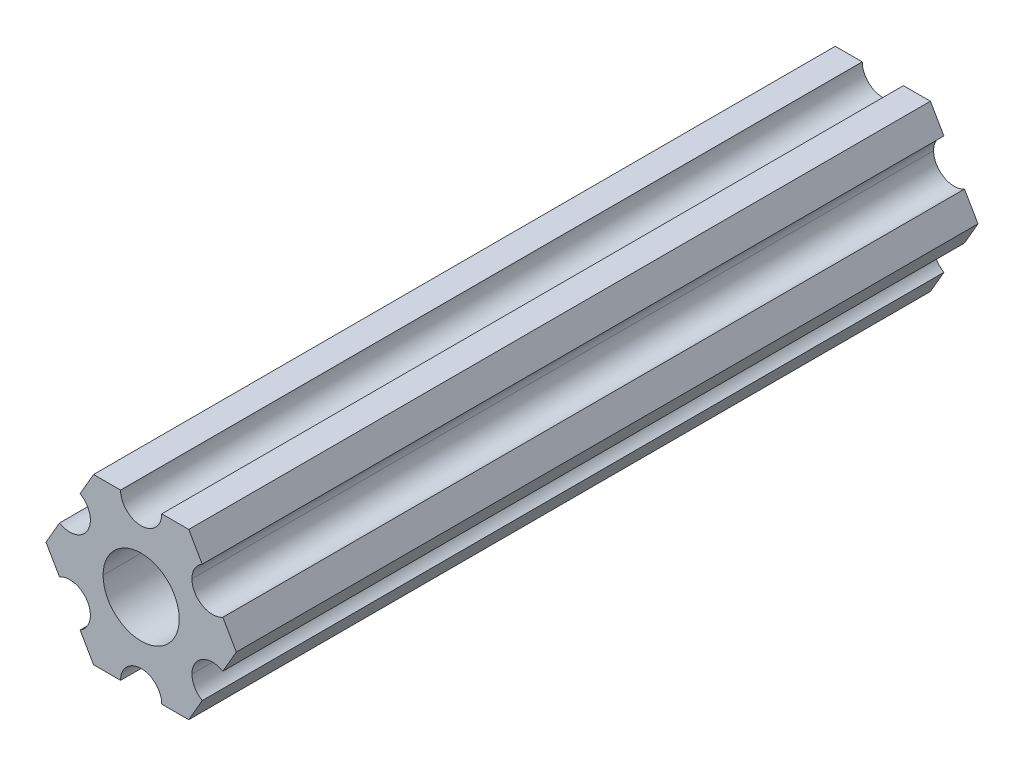
ISO-10303-21;
HEADER;
FILE_DESCRIPTION(('STEP AP214'),'2;1');
FILE_NAME('part.step','',(''),(''),'','','');
FILE_SCHEMA(('AUTOMOTIVE_DESIGN { 1 0 10303 214 1 1 1 1 }'));
ENDSEC;
DATA;
#1=APPLICATION_CONTEXT('core data for automotive mechanical design processes');
#2=APPLICATION_PROTOCOL_DEFINITION('international standard','automotive_design',2000,#1);
#3=PRODUCT_CONTEXT('',#1,'mechanical');
#4=PRODUCT('Part','Part','',(#3));
#5=PRODUCT_RELATED_PRODUCT_CATEGORY('part','',(#4));
#6=PRODUCT_DEFINITION_FORMATION('','',#4);
#7=PRODUCT_DEFINITION_CONTEXT('part definition',#1,'design');
#8=PRODUCT_DEFINITION('design','',#6,#7);
#9=PRODUCT_DEFINITION_SHAPE('','',#8);
#10=(LENGTH_UNIT() NAMED_UNIT(*) SI_UNIT(.MILLI.,.METRE.));
#11=(NAMED_UNIT(*) PLANE_ANGLE_UNIT() SI_UNIT($,.RADIAN.));
#12=(NAMED_UNIT(*) SI_UNIT($,.STERADIAN.) SOLID_ANGLE_UNIT());
#13=UNCERTAINTY_MEASURE_WITH_UNIT(LENGTH_MEASURE(1.E-05),#10,'distance_accuracy_value','');
#14=(GEOMETRIC_REPRESENTATION_CONTEXT(3) GLOBAL_UNCERTAINTY_ASSIGNED_CONTEXT((#13)) GLOBAL_UNIT_ASSIGNED_CONTEXT((#10,
#11,#12)) REPRESENTATION_CONTEXT('',''));
#15=CARTESIAN_POINT('',(0.,0.,0.));
#16=DIRECTION('',(0.,0.,1.));
#17=DIRECTION('',(1.,0.,0.));
#18=AXIS2_PLACEMENT_3D('',#15,#16,#17);
#19=CARTESIAN_POINT('',(0.,0.,304.8));
#20=DIRECTION('',(0.,0.,-1.));
#21=DIRECTION('',(-1.,0.,0.));
#22=AXIS2_PLACEMENT_3D('',#19,#20,#21);
#23=CYLINDRICAL_SURFACE('',#22,2.9337);
#24=CARTESIAN_POINT('',(0.,0.,57.15));
#25=DIRECTION('',(0.,0.,1.));
#26=DIRECTION('',(1.,0.,0.));
#27=AXIS2_PLACEMENT_3D('',#24,#25,#26);
#28=CIRCLE('',#27,2.9337);
#29=CARTESIAN_POINT('',(2.9337,0.,57.15));
#30=VERTEX_POINT('',#29);
#31=CARTESIAN_POINT('',(-2.9337,0.,57.15));
#32=VERTEX_POINT('',#31);
#33=EDGE_CURVE('E66',#30,#32,#28,.F.);
#34=ORIENTED_EDGE('',*,*,#33,.F.);
#35=DIRECTION('',(0.,0.,-1.));
#36=VECTOR('',#35,1.);
#37=CARTESIAN_POINT('',(2.9337,0.,304.8));
#38=LINE('',#37,#36);
#39=CARTESIAN_POINT('',(2.9337,0.,0.));
#40=VERTEX_POINT('',#39);
#41=EDGE_CURVE('E53',#30,#40,#38,.T.);
#42=ORIENTED_EDGE('',*,*,#41,.T.);
#43=CARTESIAN_POINT('',(0.,0.,0.));
#44=DIRECTION('',(0.,0.,1.));
#45=DIRECTION('',(1.,0.,0.));
#46=AXIS2_PLACEMENT_3D('',#43,#44,#45);
#47=CIRCLE('',#46,2.9337);
#48=CARTESIAN_POINT('',(-2.9337,0.,0.));
#49=VERTEX_POINT('',#48);
#50=EDGE_CURVE('E249',#49,#40,#47,.T.);
#51=ORIENTED_EDGE('',*,*,#50,.F.);
#52=DIRECTION('',(0.,0.,-1.));
#53=VECTOR('',#52,1.);
#54=CARTESIAN_POINT('',(-2.9337,0.,304.8));
#55=LINE('',#54,#53);
#56=EDGE_CURVE('E219',#32,#49,#55,.T.);
#57=ORIENTED_EDGE('',*,*,#56,.F.);
#58=EDGE_LOOP('',(#34,#42,#51,#57));
#59=FACE_BOUND('',#58,.T.);
#60=ADVANCED_FACE('F46',(#59),#23,.F.);
#61=CARTESIAN_POINT('',(5.49926150638082,-3.17499966684067,304.8));
#62=DIRECTION('',(0.,0.,-1.));
#63=DIRECTION('',(-1.,0.,0.));
#64=AXIS2_PLACEMENT_3D('',#61,#62,#63);
#65=CYLINDRICAL_SURFACE('',#64,1.5875);
#66=CARTESIAN_POINT('',(5.49926150638082,-3.17499966684067,57.15));
#67=DIRECTION('',(0.,0.,1.));
#68=DIRECTION('',(1.,0.,0.));
#69=AXIS2_PLACEMENT_3D('',#66,#67,#68);
#70=CIRCLE('',#69,1.5875);
#71=CARTESIAN_POINT('',(3.91176150638082,-3.17499966684067,57.15));
#72=VERTEX_POINT('',#71);
#73=CARTESIAN_POINT('',(6.29301142309098,-1.80018429024546,57.15));
#74=VERTEX_POINT('',#73);
#75=EDGE_CURVE('E373',#72,#74,#70,.F.);
#76=ORIENTED_EDGE('',*,*,#75,.F.);
#77=DIRECTION('',(0.,0.,-1.));
#78=VECTOR('',#77,1.);
#79=CARTESIAN_POINT('',(3.91176150638082,-3.17499966684067,304.8));
#80=LINE('',#79,#78);
#81=CARTESIAN_POINT('',(3.91176150638082,-3.17499966684067,0.));
#82=VERTEX_POINT('',#81);
#83=EDGE_CURVE('E226',#72,#82,#80,.T.);
#84=ORIENTED_EDGE('',*,*,#83,.T.);
#85=CARTESIAN_POINT('',(5.49926150638082,-3.17499966684067,0.));
#86=DIRECTION('',(0.,0.,-1.));
#87=DIRECTION('',(1.,0.,0.));
#88=AXIS2_PLACEMENT_3D('',#85,#86,#87);
#89=CIRCLE('',#88,1.5875);
#90=CARTESIAN_POINT('',(6.29301142309098,-1.80018429024546,0.));
#91=VERTEX_POINT('',#90);
#92=EDGE_CURVE('E228',#82,#91,#89,.T.);
#93=ORIENTED_EDGE('',*,*,#92,.T.);
#94=DIRECTION('',(0.,0.,-1.));
#95=VECTOR('',#94,1.);
#96=CARTESIAN_POINT('',(6.29301142309098,-1.80018429024546,304.8));
#97=LINE('',#96,#95);
#98=EDGE_CURVE('E354',#74,#91,#97,.T.);
#99=ORIENTED_EDGE('',*,*,#98,.F.);
#100=EDGE_LOOP('',(#76,#84,#93,#99));
#101=FACE_BOUND('',#100,.T.);
#102=ADVANCED_FACE('F409',(#101),#65,.F.);
#103=CARTESIAN_POINT('',(5.49926112168156,3.17500033315934,304.8));
#104=DIRECTION('',(0.,0.,-1.));
#105=DIRECTION('',(-1.,0.,0.));
#106=AXIS2_PLACEMENT_3D('',#103,#104,#105);
#107=CYLINDRICAL_SURFACE('',#106,1.5875);
#108=CARTESIAN_POINT('',(5.49926112168156,3.17500033315934,57.15));
#109=DIRECTION('',(0.,0.,1.));
#110=DIRECTION('',(1.,0.,0.));
#111=AXIS2_PLACEMENT_3D('',#108,#109,#110);
#112=CIRCLE('',#111,1.5875);
#113=CARTESIAN_POINT('',(3.91176112168156,3.17500033315934,57.15));
#114=VERTEX_POINT('',#113);
#115=CARTESIAN_POINT('',(4.70551103839172,4.54981561357972,57.15));
#116=VERTEX_POINT('',#115);
#117=EDGE_CURVE('E375',#114,#116,#112,.F.);
#118=ORIENTED_EDGE('',*,*,#117,.F.);
#119=DIRECTION('',(0.,0.,-1.));
#120=VECTOR('',#119,1.);
#121=CARTESIAN_POINT('',(3.91176112168156,3.17500033315934,304.8));
#122=LINE('',#121,#120);
#123=CARTESIAN_POINT('',(3.91176112168156,3.17500033315934,0.));
#124=VERTEX_POINT('',#123);
#125=EDGE_CURVE('E248',#114,#124,#122,.T.);
#126=ORIENTED_EDGE('',*,*,#125,.T.);
#127=CARTESIAN_POINT('',(5.49926112168156,3.17500033315934,0.));
#128=DIRECTION('',(0.,0.,-1.));
#129=DIRECTION('',(1.,0.,0.));
#130=AXIS2_PLACEMENT_3D('',#127,#128,#129);
#131=CIRCLE('',#130,1.5875);
#132=CARTESIAN_POINT('',(4.70551103839172,4.54981561357972,0.));
#133=VERTEX_POINT('',#132);
#134=EDGE_CURVE('E244',#124,#133,#131,.T.);
#135=ORIENTED_EDGE('',*,*,#134,.T.);
#136=DIRECTION('',(0.,0.,-1.));
#137=VECTOR('',#136,1.);
#138=CARTESIAN_POINT('',(4.70551103839172,4.54981561357972,304.8));
#139=LINE('',#138,#137);
#140=EDGE_CURVE('E287',#116,#133,#139,.T.);
#141=ORIENTED_EDGE('',*,*,#140,.F.);
#142=EDGE_LOOP('',(#118,#126,#135,#141));
#143=FACE_BOUND('',#142,.T.);
#144=ADVANCED_FACE('F483',(#143),#107,.F.);
#145=CARTESIAN_POINT('',(6.29301142309098,-1.80018429024546,304.8));
#146=DIRECTION('',(-0.866025434075723,0.499999947533953,0.));
#147=DIRECTION('',(0.,0.,1.));
#148=AXIS2_PLACEMENT_3D('',#145,#146,#147);
#149=PLANE('',#148);
#150=DIRECTION('',(0.499999947533953,0.866025434075723,0.));
#151=VECTOR('',#150,1.);
#152=CARTESIAN_POINT('',(6.29301142309098,-1.80018429024546,57.15));
#153=LINE('',#152,#151);
#154=CARTESIAN_POINT('',(7.33234841870827,4.44212519169686E-07,57.15));
#155=VERTEX_POINT('',#154);
#156=EDGE_CURVE('E293',#74,#155,#153,.T.);
#157=ORIENTED_EDGE('',*,*,#156,.F.);
#158=ORIENTED_EDGE('',*,*,#98,.T.);
#159=DIRECTION('',(0.499999947533953,0.866025434075723,0.));
#160=VECTOR('',#159,1.);
#161=CARTESIAN_POINT('',(6.29301142309098,-1.80018429024546,0.));
#162=LINE('',#161,#160);
#163=CARTESIAN_POINT('',(7.33234841870827,4.44212519169686E-07,0.));
#164=VERTEX_POINT('',#163);
#165=EDGE_CURVE('E252',#91,#164,#162,.T.);
#166=ORIENTED_EDGE('',*,*,#165,.T.);
#167=DIRECTION('',(0.,0.,-1.));
#168=VECTOR('',#167,1.);
#169=CARTESIAN_POINT('',(7.33234841870827,4.44212519169686E-07,304.8));
#170=LINE('',#169,#168);
#171=EDGE_CURVE('E259',#155,#164,#170,.T.);
#172=ORIENTED_EDGE('',*,*,#171,.F.);
#173=EDGE_LOOP('',(#157,#158,#166,#172));
#174=FACE_BOUND('',#173,.T.);
#175=ADVANCED_FACE('F492',(#174),#149,.F.);
#176=CARTESIAN_POINT('',(7.33234841870827,4.44212519169686E-07,304.8));
#177=DIRECTION('',(-0.866025373493145,-0.500000052466057,0.));
#178=DIRECTION('',(-0.500000052466057,0.866025373493145,0.));
#179=AXIS2_PLACEMENT_3D('',#176,#177,#178);
#180=PLANE('',#179);
#181=DIRECTION('',(-0.500000052466057,0.866025373493145,0.));
#182=VECTOR('',#181,1.);
#183=CARTESIAN_POINT('',(7.33234841870827,4.44212519169686E-07,57.15));
#184=LINE('',#183,#182);
#185=CARTESIAN_POINT('',(6.29301120497139,1.80018505273895,57.15));
#186=VERTEX_POINT('',#185);
#187=EDGE_CURVE('E369',#155,#186,#184,.T.);
#188=ORIENTED_EDGE('',*,*,#187,.F.);
#189=ORIENTED_EDGE('',*,*,#171,.T.);
#190=DIRECTION('',(-0.500000052466056,0.866025373493145,0.));
#191=VECTOR('',#190,1.);
#192=CARTESIAN_POINT('',(7.33234841870827,4.44212519169686E-07,0.));
#193=LINE('',#192,#191);
#194=CARTESIAN_POINT('',(6.29301120497139,1.80018505273894,0.));
#195=VERTEX_POINT('',#194);
#196=EDGE_CURVE('E342',#164,#195,#193,.T.);
#197=ORIENTED_EDGE('',*,*,#196,.T.);
#198=DIRECTION('',(0.,0.,-1.));
#199=VECTOR('',#198,1.);
#200=CARTESIAN_POINT('',(6.29301120497139,1.80018505273894,304.8));
#201=LINE('',#200,#199);
#202=EDGE_CURVE('E257',#186,#195,#201,.T.);
#203=ORIENTED_EDGE('',*,*,#202,.F.);
#204=EDGE_LOOP('',(#188,#189,#197,#203));
#205=FACE_BOUND('',#204,.T.);
#206=ADVANCED_FACE('F490',(#205),#180,.F.);
#207=CARTESIAN_POINT('',(5.49926112168156,3.17500033315934,304.8));
#208=DIRECTION('',(0.,0.,-1.));
#209=DIRECTION('',(-1.,0.,0.));
#210=AXIS2_PLACEMENT_3D('',#207,#208,#209);
#211=CYLINDRICAL_SURFACE('',#210,1.5875);
#212=CARTESIAN_POINT('',(5.49926112168156,3.17500033315934,57.15));
#213=DIRECTION('',(0.,0.,1.));
#214=DIRECTION('',(1.,0.,0.));
#215=AXIS2_PLACEMENT_3D('',#212,#213,#214);
#216=CIRCLE('',#215,1.5875);
#217=EDGE_CURVE('E371',#186,#114,#216,.F.);
#218=ORIENTED_EDGE('',*,*,#217,.F.);
#219=ORIENTED_EDGE('',*,*,#202,.T.);
#220=CARTESIAN_POINT('',(5.49926112168156,3.17500033315934,0.));
#221=DIRECTION('',(0.,0.,-1.));
#222=DIRECTION('',(1.,0.,0.));
#223=AXIS2_PLACEMENT_3D('',#220,#221,#222);
#224=CIRCLE('',#223,1.5875);
#225=EDGE_CURVE('E260',#195,#124,#224,.T.);
#226=ORIENTED_EDGE('',*,*,#225,.T.);
#227=ORIENTED_EDGE('',*,*,#125,.F.);
#228=EDGE_LOOP('',(#218,#219,#226,#227));
#229=FACE_BOUND('',#228,.T.);
#230=ADVANCED_FACE('F488',(#229),#211,.F.);
#231=CARTESIAN_POINT('',(4.70551103839172,4.54981561357972,304.8));
#232=DIRECTION('',(-0.866025373493151,-0.500000052466046,0.));
#233=DIRECTION('',(-0.500000052466046,0.866025373493151,0.));
#234=AXIS2_PLACEMENT_3D('',#231,#232,#233);
#235=PLANE('',#234);
#236=DIRECTION('',(-0.500000052466046,0.866025373493151,0.));
#237=VECTOR('',#236,1.);
#238=CARTESIAN_POINT('',(4.70551103839172,4.54981561357972,57.15));
#239=LINE('',#238,#237);
#240=CARTESIAN_POINT('',(3.66617382465481,6.35000022210627,57.15));
#241=VERTEX_POINT('',#240);
#242=EDGE_CURVE('E377',#116,#241,#239,.T.);
#243=ORIENTED_EDGE('',*,*,#242,.F.);
#244=ORIENTED_EDGE('',*,*,#140,.T.);
#245=DIRECTION('',(-0.500000052466046,0.866025373493151,0.));
#246=VECTOR('',#245,1.);
#247=CARTESIAN_POINT('',(4.70551103839172,4.54981561357972,0.));
#248=LINE('',#247,#246);
#249=CARTESIAN_POINT('',(3.66617382465481,6.35000022210627,0.));
#250=VERTEX_POINT('',#249);
#251=EDGE_CURVE('E306',#133,#250,#248,.T.);
#252=ORIENTED_EDGE('',*,*,#251,.T.);
#253=DIRECTION('',(0.,0.,-1.));
#254=VECTOR('',#253,1.);
#255=CARTESIAN_POINT('',(3.66617382465481,6.35000022210627,304.8));
#256=LINE('',#255,#254);
#257=EDGE_CURVE('E288',#241,#250,#256,.T.);
#258=ORIENTED_EDGE('',*,*,#257,.F.);
#259=EDGE_LOOP('',(#243,#244,#252,#258));
#260=FACE_BOUND('',#259,.T.);
#261=ADVANCED_FACE('F479',(#260),#235,.F.);
#262=CARTESIAN_POINT('',(3.66617382465481,6.35000022210627,304.8));
#263=DIRECTION('',(6.05825850611185E-08,-1.,0.));
#264=DIRECTION('',(0.,0.,-1.));
#265=AXIS2_PLACEMENT_3D('',#262,#263,#264);
#266=PLANE('',#265);
#267=DIRECTION('',(-0.999999999999998,-6.05825850611184E-08,0.));
#268=VECTOR('',#267,1.);
#269=CARTESIAN_POINT('',(3.66617382465481,6.35000022210627,57.15));
#270=LINE('',#269,#268);
#271=CARTESIAN_POINT('',(1.58749961530074,6.35,57.15));
#272=VERTEX_POINT('',#271);
#273=EDGE_CURVE('E379',#241,#272,#270,.T.);
#274=ORIENTED_EDGE('',*,*,#273,.F.);
#275=ORIENTED_EDGE('',*,*,#257,.T.);
#276=DIRECTION('',(-1.,-6.05825850611185E-08,0.));
#277=VECTOR('',#276,1.);
#278=CARTESIAN_POINT('',(3.66617382465481,6.35000022210627,0.));
#279=LINE('',#278,#277);
#280=CARTESIAN_POINT('',(1.58749961530074,6.35000009617482,0.));
#281=VERTEX_POINT('',#280);
#282=EDGE_CURVE('E283',#250,#281,#279,.T.);
#283=ORIENTED_EDGE('',*,*,#282,.T.);
#284=DIRECTION('',(0.,0.,-1.));
#285=VECTOR('',#284,1.);
#286=CARTESIAN_POINT('',(1.58749961530074,6.35000009617482,304.8));
#287=LINE('',#286,#285);
#288=EDGE_CURVE('E261',#272,#281,#287,.T.);
#289=ORIENTED_EDGE('',*,*,#288,.F.);
#290=EDGE_LOOP('',(#274,#275,#283,#289));
#291=FACE_BOUND('',#290,.T.);
#292=ADVANCED_FACE('F473',(#291),#266,.F.);
#293=CARTESIAN_POINT('',(-3.84699260060323E-07,6.35,304.8));
#294=DIRECTION('',(0.,0.,-1.));
#295=DIRECTION('',(-1.,0.,0.));
#296=AXIS2_PLACEMENT_3D('',#293,#294,#295);
#297=CYLINDRICAL_SURFACE('',#296,1.5875);
#298=CARTESIAN_POINT('',(-3.84699260060323E-07,6.35,57.15));
#299=DIRECTION('',(0.,0.,1.));
#300=DIRECTION('',(1.,0.,0.));
#301=AXIS2_PLACEMENT_3D('',#298,#299,#300);
#302=CIRCLE('',#301,1.5875);
#303=CARTESIAN_POINT('',(-1.58750038469926,6.34999990382518,57.15));
#304=VERTEX_POINT('',#303);
#305=EDGE_CURVE('E381',#272,#304,#302,.F.);
#306=ORIENTED_EDGE('',*,*,#305,.F.);
#307=ORIENTED_EDGE('',*,*,#288,.T.);
#308=CARTESIAN_POINT('',(-3.84699260060323E-07,6.35,0.));
#309=DIRECTION('',(0.,0.,-1.));
#310=DIRECTION('',(1.,0.,0.));
#311=AXIS2_PLACEMENT_3D('',#308,#309,#310);
#312=CIRCLE('',#311,1.5875);
#313=CARTESIAN_POINT('',(-1.58750038469926,6.34999990382519,0.));
#314=VERTEX_POINT('',#313);
#315=EDGE_CURVE('E263',#281,#314,#312,.T.);
#316=ORIENTED_EDGE('',*,*,#315,.T.);
#317=DIRECTION('',(0.,0.,-1.));
#318=VECTOR('',#317,1.);
#319=CARTESIAN_POINT('',(-1.58750038469926,6.34999990382519,304.8));
#320=LINE('',#319,#318);
#321=EDGE_CURVE('E300',#304,#314,#320,.T.);
#322=ORIENTED_EDGE('',*,*,#321,.F.);
#323=EDGE_LOOP('',(#306,#307,#316,#322));
#324=FACE_BOUND('',#323,.T.);
#325=ADVANCED_FACE('F469',(#324),#297,.F.);
#326=CARTESIAN_POINT('',(-1.58750038469926,6.34999990382518,304.8));
#327=DIRECTION('',(6.05825963273174E-08,-1.,0.));
#328=DIRECTION('',(0.,0.,-1.));
#329=AXIS2_PLACEMENT_3D('',#326,#327,#328);
#330=PLANE('',#329);
#331=DIRECTION('',(-0.999999999999998,-6.05825963273173E-08,0.));
#332=VECTOR('',#331,1.);
#333=CARTESIAN_POINT('',(-1.58750038469926,6.34999990382518,57.15));
#334=LINE('',#333,#332);
#335=CARTESIAN_POINT('',(-3.66617459405349,6.3499997778937,57.15));
#336=VERTEX_POINT('',#335);
#337=EDGE_CURVE('E383',#304,#336,#334,.T.);
#338=ORIENTED_EDGE('',*,*,#337,.F.);
#339=ORIENTED_EDGE('',*,*,#321,.T.);
#340=DIRECTION('',(-1.,-6.05825963273174E-08,0.));
#341=VECTOR('',#340,1.);
#342=CARTESIAN_POINT('',(-1.58750038469926,6.34999990382518,0.));
#343=LINE('',#342,#341);
#344=CARTESIAN_POINT('',(-3.66617459405349,6.3499997778937,0.));
#345=VERTEX_POINT('',#344);
#346=EDGE_CURVE('E264',#314,#345,#343,.T.);
#347=ORIENTED_EDGE('',*,*,#346,.T.);
#348=DIRECTION('',(0.,0.,-1.));
#349=VECTOR('',#348,1.);
#350=CARTESIAN_POINT('',(-3.66617459405349,6.3499997778937,304.8));
#351=LINE('',#350,#349);
#352=EDGE_CURVE('E279',#336,#345,#351,.T.);
#353=ORIENTED_EDGE('',*,*,#352,.F.);
#354=EDGE_LOOP('',(#338,#339,#347,#353));
#355=FACE_BOUND('',#354,.T.);
#356=ADVANCED_FACE('F511',(#355),#330,.F.);
#357=CARTESIAN_POINT('',(-3.66617459405349,6.3499997778937,304.8));
#358=DIRECTION('',(0.866025434075729,-0.499999947533942,0.));
#359=DIRECTION('',(0.,0.,-1.));
#360=AXIS2_PLACEMENT_3D('',#357,#358,#359);
#361=PLANE('',#360);
#362=DIRECTION('',(-0.499999947533942,-0.866025434075729,0.));
#363=VECTOR('',#362,1.);
#364=CARTESIAN_POINT('',(-3.66617459405349,6.3499997778937,57.15));
#365=LINE('',#364,#363);
#366=CARTESIAN_POINT('',(-4.70551158967065,4.54981504343587,57.15));
#367=VERTEX_POINT('',#366);
#368=EDGE_CURVE('E385',#336,#367,#365,.T.);
#369=ORIENTED_EDGE('',*,*,#368,.F.);
#370=ORIENTED_EDGE('',*,*,#352,.T.);
#371=DIRECTION('',(-0.499999947533943,-0.866025434075729,0.));
#372=VECTOR('',#371,1.);
#373=CARTESIAN_POINT('',(-3.66617459405349,6.3499997778937,0.));
#374=LINE('',#373,#372);
#375=CARTESIAN_POINT('',(-4.70551158967065,4.54981504343587,0.));
#376=VERTEX_POINT('',#375);
#377=EDGE_CURVE('E281',#345,#376,#374,.T.);
#378=ORIENTED_EDGE('',*,*,#377,.T.);
#379=DIRECTION('',(0.,0.,-1.));
#380=VECTOR('',#379,1.);
#381=CARTESIAN_POINT('',(-4.70551158967065,4.54981504343587,304.8));
#382=LINE('',#381,#380);
#383=EDGE_CURVE('E256',#367,#376,#382,.T.);
#384=ORIENTED_EDGE('',*,*,#383,.F.);
#385=EDGE_LOOP('',(#369,#370,#378,#384));
#386=FACE_BOUND('',#385,.T.);
#387=ADVANCED_FACE('F464',(#386),#361,.F.);
#388=CARTESIAN_POINT('',(-5.49926150638082,3.17499966684067,304.8));
#389=DIRECTION('',(0.,0.,-1.));
#390=DIRECTION('',(-1.,0.,0.));
#391=AXIS2_PLACEMENT_3D('',#388,#389,#390);
#392=CYLINDRICAL_SURFACE('',#391,1.5875);
#393=CARTESIAN_POINT('',(-5.49926150638082,3.17499966684067,57.15));
#394=DIRECTION('',(0.,0.,1.));
#395=DIRECTION('',(1.,0.,0.));
#396=AXIS2_PLACEMENT_3D('',#393,#394,#395);
#397=CIRCLE('',#396,1.5875);
#398=CARTESIAN_POINT('',(-6.29301142309098,1.80018429024547,57.15));
#399=VERTEX_POINT('',#398);
#400=EDGE_CURVE('E387',#367,#399,#397,.F.);
#401=ORIENTED_EDGE('',*,*,#400,.F.);
#402=ORIENTED_EDGE('',*,*,#383,.T.);
#403=CARTESIAN_POINT('',(-5.49926150638082,3.17499966684067,0.));
#404=DIRECTION('',(0.,0.,-1.));
#405=DIRECTION('',(1.,0.,0.));
#406=AXIS2_PLACEMENT_3D('',#403,#404,#405);
#407=CIRCLE('',#406,1.5875);
#408=CARTESIAN_POINT('',(-6.29301142309098,1.80018429024547,0.));
#409=VERTEX_POINT('',#408);
#410=EDGE_CURVE('E282',#376,#409,#407,.T.);
#411=ORIENTED_EDGE('',*,*,#410,.T.);
#412=DIRECTION('',(0.,0.,-1.));
#413=VECTOR('',#412,1.);
#414=CARTESIAN_POINT('',(-6.29301142309098,1.80018429024547,304.8));
#415=LINE('',#414,#413);
#416=EDGE_CURVE('E232',#399,#409,#415,.T.);
#417=ORIENTED_EDGE('',*,*,#416,.F.);
#418=EDGE_LOOP('',(#401,#402,#411,#417));
#419=FACE_BOUND('',#418,.T.);
#420=ADVANCED_FACE('F460',(#419),#392,.F.);
#421=CARTESIAN_POINT('',(-6.29301142309098,1.80018429024547,304.8));
#422=DIRECTION('',(0.866025434075724,-0.499999947533952,0.));
#423=DIRECTION('',(0.,0.,-1.));
#424=AXIS2_PLACEMENT_3D('',#421,#422,#423);
#425=PLANE('',#424);
#426=DIRECTION('',(-0.499999947533952,-0.866025434075724,0.));
#427=VECTOR('',#426,1.);
#428=CARTESIAN_POINT('',(-6.29301142309098,1.80018429024547,57.15));
#429=LINE('',#428,#427);
#430=CARTESIAN_POINT('',(-7.33234841870827,-4.44212523790841E-07,57.15));
#431=VERTEX_POINT('',#430);
#432=EDGE_CURVE('E389',#399,#431,#429,.T.);
#433=ORIENTED_EDGE('',*,*,#432,.F.);
#434=ORIENTED_EDGE('',*,*,#416,.T.);
#435=DIRECTION('',(-0.499999947533951,-0.866025434075724,0.));
#436=VECTOR('',#435,1.);
#437=CARTESIAN_POINT('',(-6.29301142309098,1.80018429024547,0.));
#438=LINE('',#437,#436);
#439=CARTESIAN_POINT('',(-7.33234841870827,-4.44212523790841E-07,0.));
#440=VERTEX_POINT('',#439);
#441=EDGE_CURVE('E234',#409,#440,#438,.T.);
#442=ORIENTED_EDGE('',*,*,#441,.T.);
#443=DIRECTION('',(0.,0.,-1.));
#444=VECTOR('',#443,1.);
#445=CARTESIAN_POINT('',(-7.33234841870827,-4.44212523790841E-07,304.8));
#446=LINE('',#445,#444);
#447=EDGE_CURVE('E265',#431,#440,#446,.T.);
#448=ORIENTED_EDGE('',*,*,#447,.F.);
#449=EDGE_LOOP('',(#433,#434,#442,#448));
#450=FACE_BOUND('',#449,.T.);
#451=ADVANCED_FACE('F454',(#450),#425,.F.);
#452=CARTESIAN_POINT('',(-7.33234841870827,-4.44212523790841E-07,304.8));
#453=DIRECTION('',(0.866025373493151,0.500000052466045,0.));
#454=DIRECTION('',(0.,0.,-1.));
#455=AXIS2_PLACEMENT_3D('',#452,#453,#454);
#456=PLANE('',#455);
#457=DIRECTION('',(0.500000052466045,-0.866025373493151,0.));
#458=VECTOR('',#457,1.);
#459=CARTESIAN_POINT('',(-7.33234841870827,-4.44212523790841E-07,57.15));
#460=LINE('',#459,#458);
#461=CARTESIAN_POINT('',(-6.29301120497141,-1.80018505273896,57.15));
#462=VERTEX_POINT('',#461);
#463=EDGE_CURVE('E391',#431,#462,#460,.T.);
#464=ORIENTED_EDGE('',*,*,#463,.F.);
#465=ORIENTED_EDGE('',*,*,#447,.T.);
#466=DIRECTION('',(0.500000052466045,-0.866025373493151,0.));
#467=VECTOR('',#466,1.);
#468=CARTESIAN_POINT('',(-7.33234841870827,-4.44212523790841E-07,0.));
#469=LINE('',#468,#467);
#470=CARTESIAN_POINT('',(-6.29301120497141,-1.80018505273897,0.));
#471=VERTEX_POINT('',#470);
#472=EDGE_CURVE('E235',#440,#471,#469,.T.);
#473=ORIENTED_EDGE('',*,*,#472,.T.);
#474=DIRECTION('',(0.,0.,-1.));
#475=VECTOR('',#474,1.);
#476=CARTESIAN_POINT('',(-6.29301120497141,-1.80018505273897,304.8));
#477=LINE('',#476,#475);
#478=EDGE_CURVE('E243',#462,#471,#477,.T.);
#479=ORIENTED_EDGE('',*,*,#478,.F.);
#480=EDGE_LOOP('',(#464,#465,#473,#479));
#481=FACE_BOUND('',#480,.T.);
#482=ADVANCED_FACE('F450',(#481),#456,.F.);
#483=CARTESIAN_POINT('',(-5.49926112168156,-3.17500033315934,304.8));
#484=DIRECTION('',(0.,0.,-1.));
#485=DIRECTION('',(-1.,0.,0.));
#486=AXIS2_PLACEMENT_3D('',#483,#484,#485);
#487=CYLINDRICAL_SURFACE('',#486,1.5875);
#488=CARTESIAN_POINT('',(-5.49926112168156,-3.17500033315934,57.15));
#489=DIRECTION('',(0.,0.,1.));
#490=DIRECTION('',(1.,0.,0.));
#491=AXIS2_PLACEMENT_3D('',#488,#489,#490);
#492=CIRCLE('',#491,1.5875);
#493=CARTESIAN_POINT('',(-4.70551103839172,-4.54981561357972,57.15));
#494=VERTEX_POINT('',#493);
#495=EDGE_CURVE('E393',#462,#494,#492,.F.);
#496=ORIENTED_EDGE('',*,*,#495,.F.);
#497=ORIENTED_EDGE('',*,*,#478,.T.);
#498=CARTESIAN_POINT('',(-5.49926112168156,-3.17500033315934,0.));
#499=DIRECTION('',(0.,0.,-1.));
#500=DIRECTION('',(1.,0.,0.));
#501=AXIS2_PLACEMENT_3D('',#498,#499,#500);
#502=CIRCLE('',#501,1.5875);
#503=CARTESIAN_POINT('',(-4.70551103839172,-4.54981561357972,0.));
#504=VERTEX_POINT('',#503);
#505=EDGE_CURVE('E267',#471,#504,#502,.T.);
#506=ORIENTED_EDGE('',*,*,#505,.T.);
#507=DIRECTION('',(0.,0.,-1.));
#508=VECTOR('',#507,1.);
#509=CARTESIAN_POINT('',(-4.70551103839172,-4.54981561357972,304.8));
#510=LINE('',#509,#508);
#511=EDGE_CURVE('E236',#494,#504,#510,.T.);
#512=ORIENTED_EDGE('',*,*,#511,.F.);
#513=EDGE_LOOP('',(#496,#497,#506,#512));
#514=FACE_BOUND('',#513,.T.);
#515=ADVANCED_FACE('F444',(#514),#487,.F.);
#516=CARTESIAN_POINT('',(-4.70551103839172,-4.54981561357972,304.8));
#517=DIRECTION('',(0.866025373493152,0.500000052466045,0.));
#518=DIRECTION('',(0.,0.,-1.));
#519=AXIS2_PLACEMENT_3D('',#516,#517,#518);
#520=PLANE('',#519);
#521=DIRECTION('',(0.500000052466045,-0.866025373493152,0.));
#522=VECTOR('',#521,1.);
#523=CARTESIAN_POINT('',(-4.70551103839172,-4.54981561357972,57.15));
#524=LINE('',#523,#522);
#525=CARTESIAN_POINT('',(-3.66617382465481,-6.35000022210628,57.15));
#526=VERTEX_POINT('',#525);
#527=EDGE_CURVE('E395',#494,#526,#524,.T.);
#528=ORIENTED_EDGE('',*,*,#527,.F.);
#529=ORIENTED_EDGE('',*,*,#511,.T.);
#530=DIRECTION('',(0.500000052466045,-0.866025373493152,0.));
#531=VECTOR('',#530,1.);
#532=CARTESIAN_POINT('',(-4.70551103839172,-4.54981561357972,0.));
#533=LINE('',#532,#531);
#534=CARTESIAN_POINT('',(-3.66617382465481,-6.35000022210628,0.));
#535=VERTEX_POINT('',#534);
#536=EDGE_CURVE('E238',#504,#535,#533,.T.);
#537=ORIENTED_EDGE('',*,*,#536,.T.);
#538=DIRECTION('',(0.,0.,-1.));
#539=VECTOR('',#538,1.);
#540=CARTESIAN_POINT('',(-3.66617382465481,-6.35000022210628,304.8));
#541=LINE('',#540,#539);
#542=EDGE_CURVE('E340',#526,#535,#541,.T.);
#543=ORIENTED_EDGE('',*,*,#542,.F.);
#544=EDGE_LOOP('',(#528,#529,#537,#543));
#545=FACE_BOUND('',#544,.T.);
#546=ADVANCED_FACE('F440',(#545),#520,.F.);
#547=CARTESIAN_POINT('',(-3.66617382465481,-6.35000022210628,304.8));
#548=DIRECTION('',(-6.05825854783851E-08,1.,0.));
#549=DIRECTION('',(0.,0.,1.));
#550=AXIS2_PLACEMENT_3D('',#547,#548,#549);
#551=PLANE('',#550);
#552=DIRECTION('',(0.999999999999998,6.0582585478385E-08,0.));
#553=VECTOR('',#552,1.);
#554=CARTESIAN_POINT('',(-3.66617382465481,-6.35000022210628,57.15));
#555=LINE('',#554,#553);
#556=CARTESIAN_POINT('',(-1.58749961530073,-6.35000009617482,57.15));
#557=VERTEX_POINT('',#556);
#558=EDGE_CURVE('E397',#526,#557,#555,.T.);
#559=ORIENTED_EDGE('',*,*,#558,.F.);
#560=ORIENTED_EDGE('',*,*,#542,.T.);
#561=DIRECTION('',(1.,6.05825854783851E-08,0.));
#562=VECTOR('',#561,1.);
#563=CARTESIAN_POINT('',(-3.66617382465481,-6.35000022210628,0.));
#564=LINE('',#563,#562);
#565=CARTESIAN_POINT('',(-1.58749961530073,-6.35000009617482,0.));
#566=VERTEX_POINT('',#565);
#567=EDGE_CURVE('E239',#535,#566,#564,.T.);
#568=ORIENTED_EDGE('',*,*,#567,.T.);
#569=DIRECTION('',(0.,0.,-1.));
#570=VECTOR('',#569,1.);
#571=CARTESIAN_POINT('',(-1.58749961530073,-6.35000009617482,304.8));
#572=LINE('',#571,#570);
#573=EDGE_CURVE('E305',#557,#566,#572,.T.);
#574=ORIENTED_EDGE('',*,*,#573,.F.);
#575=EDGE_LOOP('',(#559,#560,#568,#574));
#576=FACE_BOUND('',#575,.T.);
#577=ADVANCED_FACE('F434',(#576),#551,.F.);
#578=CARTESIAN_POINT('',(3.8469926204343E-07,-6.35,304.8));
#579=DIRECTION('',(0.,0.,-1.));
#580=DIRECTION('',(-1.,0.,0.));
#581=AXIS2_PLACEMENT_3D('',#578,#579,#580);
#582=CYLINDRICAL_SURFACE('',#581,1.5875);
#583=CARTESIAN_POINT('',(3.8469926204343E-07,-6.35,57.15));
#584=DIRECTION('',(0.,0.,1.));
#585=DIRECTION('',(1.,0.,0.));
#586=AXIS2_PLACEMENT_3D('',#583,#584,#585);
#587=CIRCLE('',#586,1.5875);
#588=CARTESIAN_POINT('',(1.58750038469926,-6.34999990382518,57.15));
#589=VERTEX_POINT('',#588);
#590=EDGE_CURVE('E399',#557,#589,#587,.F.);
#591=ORIENTED_EDGE('',*,*,#590,.F.);
#592=ORIENTED_EDGE('',*,*,#573,.T.);
#593=CARTESIAN_POINT('',(3.8469926204343E-07,-6.35,0.));
#594=DIRECTION('',(0.,0.,-1.));
#595=DIRECTION('',(1.,0.,0.));
#596=AXIS2_PLACEMENT_3D('',#593,#594,#595);
#597=CIRCLE('',#596,1.5875);
#598=CARTESIAN_POINT('',(1.58750038469926,-6.34999990382518,0.));
#599=VERTEX_POINT('',#598);
#600=EDGE_CURVE('E336',#566,#599,#597,.T.);
#601=ORIENTED_EDGE('',*,*,#600,.T.);
#602=DIRECTION('',(0.,0.,-1.));
#603=VECTOR('',#602,1.);
#604=CARTESIAN_POINT('',(1.58750038469926,-6.34999990382518,304.8));
#605=LINE('',#604,#603);
#606=EDGE_CURVE('E273',#589,#599,#605,.T.);
#607=ORIENTED_EDGE('',*,*,#606,.F.);
#608=EDGE_LOOP('',(#591,#592,#601,#607));
#609=FACE_BOUND('',#608,.T.);
#610=ADVANCED_FACE('F430',(#609),#582,.F.);
#611=CARTESIAN_POINT('',(1.58750038469926,-6.34999990382518,304.8));
#612=DIRECTION('',(-6.05825721258438E-08,1.,0.));
#613=DIRECTION('',(0.,0.,1.));
#614=AXIS2_PLACEMENT_3D('',#611,#612,#613);
#615=PLANE('',#614);
#616=DIRECTION('',(0.999999999999998,6.05825721258437E-08,0.));
#617=VECTOR('',#616,1.);
#618=CARTESIAN_POINT('',(1.58750038469926,-6.34999990382518,57.15));
#619=LINE('',#618,#617);
#620=CARTESIAN_POINT('',(3.66617459405346,-6.34999977789375,57.15));
#621=VERTEX_POINT('',#620);
#622=EDGE_CURVE('E401',#589,#621,#619,.T.);
#623=ORIENTED_EDGE('',*,*,#622,.F.);
#624=ORIENTED_EDGE('',*,*,#606,.T.);
#625=DIRECTION('',(1.,6.05825721258438E-08,0.));
#626=VECTOR('',#625,1.);
#627=CARTESIAN_POINT('',(1.58750038469926,-6.34999990382518,0.));
#628=LINE('',#627,#626);
#629=CARTESIAN_POINT('',(3.66617459405346,-6.34999977789375,0.));
#630=VERTEX_POINT('',#629);
#631=EDGE_CURVE('E301',#599,#630,#628,.T.);
#632=ORIENTED_EDGE('',*,*,#631,.T.);
#633=DIRECTION('',(0.,0.,-1.));
#634=VECTOR('',#633,1.);
#635=CARTESIAN_POINT('',(3.66617459405346,-6.34999977789375,304.8));
#636=LINE('',#635,#634);
#637=EDGE_CURVE('E274',#621,#630,#636,.T.);
#638=ORIENTED_EDGE('',*,*,#637,.F.);
#639=EDGE_LOOP('',(#623,#624,#632,#638));
#640=FACE_BOUND('',#639,.T.);
#641=ADVANCED_FACE('F424',(#640),#615,.F.);
#642=CARTESIAN_POINT('',(3.66617459405346,-6.34999977789375,304.8));
#643=DIRECTION('',(-0.86602543407573,0.499999947533941,0.));
#644=DIRECTION('',(0.,0.,1.));
#645=AXIS2_PLACEMENT_3D('',#642,#643,#644);
#646=PLANE('',#645);
#647=DIRECTION('',(0.499999947533941,0.86602543407573,0.));
#648=VECTOR('',#647,1.);
#649=CARTESIAN_POINT('',(3.66617459405346,-6.34999977789375,57.15));
#650=LINE('',#649,#648);
#651=CARTESIAN_POINT('',(4.70551158967065,-4.54981504343587,57.15));
#652=VERTEX_POINT('',#651);
#653=EDGE_CURVE('E60',#621,#652,#650,.T.);
#654=ORIENTED_EDGE('',*,*,#653,.F.);
#655=ORIENTED_EDGE('',*,*,#637,.T.);
#656=DIRECTION('',(0.499999947533941,0.86602543407573,0.));
#657=VECTOR('',#656,1.);
#658=CARTESIAN_POINT('',(3.66617459405346,-6.34999977789375,0.));
#659=LINE('',#658,#657);
#660=CARTESIAN_POINT('',(4.70551158967065,-4.54981504343587,0.));
#661=VERTEX_POINT('',#660);
#662=EDGE_CURVE('E269',#630,#661,#659,.T.);
#663=ORIENTED_EDGE('',*,*,#662,.T.);
#664=DIRECTION('',(0.,0.,-1.));
#665=VECTOR('',#664,1.);
#666=CARTESIAN_POINT('',(4.70551158967065,-4.54981504343587,304.8));
#667=LINE('',#666,#665);
#668=EDGE_CURVE('E275',#652,#661,#667,.T.);
#669=ORIENTED_EDGE('',*,*,#668,.F.);
#670=EDGE_LOOP('',(#654,#655,#663,#669));
#671=FACE_BOUND('',#670,.T.);
#672=ADVANCED_FACE('F420',(#671),#646,.F.);
#673=CARTESIAN_POINT('',(5.49926150638082,-3.17499966684067,304.8));
#674=DIRECTION('',(0.,0.,-1.));
#675=DIRECTION('',(-1.,0.,0.));
#676=AXIS2_PLACEMENT_3D('',#673,#674,#675);
#677=CYLINDRICAL_SURFACE('',#676,1.5875);
#678=CARTESIAN_POINT('',(5.49926150638082,-3.17499966684067,57.15));
#679=DIRECTION('',(0.,0.,1.));
#680=DIRECTION('',(1.,0.,0.));
#681=AXIS2_PLACEMENT_3D('',#678,#679,#680);
#682=CIRCLE('',#681,1.5875);
#683=EDGE_CURVE('E220',#652,#72,#682,.F.);
#684=ORIENTED_EDGE('',*,*,#683,.F.);
#685=ORIENTED_EDGE('',*,*,#668,.T.);
#686=CARTESIAN_POINT('',(5.49926150638082,-3.17499966684067,0.));
#687=DIRECTION('',(0.,0.,-1.));
#688=DIRECTION('',(1.,0.,0.));
#689=AXIS2_PLACEMENT_3D('',#686,#687,#688);
#690=CIRCLE('',#689,1.5875);
#691=EDGE_CURVE('E277',#661,#82,#690,.T.);
#692=ORIENTED_EDGE('',*,*,#691,.T.);
#693=ORIENTED_EDGE('',*,*,#83,.F.);
#694=EDGE_LOOP('',(#684,#685,#692,#693));
#695=FACE_BOUND('',#694,.T.);
#696=ADVANCED_FACE('F411',(#695),#677,.F.);
#697=CARTESIAN_POINT('',(0.,0.,304.8));
#698=DIRECTION('',(0.,0.,-1.));
#699=DIRECTION('',(-1.,0.,0.));
#700=AXIS2_PLACEMENT_3D('',#697,#698,#699);
#701=CYLINDRICAL_SURFACE('',#700,2.9337);
#702=CARTESIAN_POINT('',(0.,0.,57.15));
#703=DIRECTION('',(0.,0.,1.));
#704=DIRECTION('',(1.,0.,0.));
#705=AXIS2_PLACEMENT_3D('',#702,#703,#704);
#706=CIRCLE('',#705,2.9337);
#707=EDGE_CURVE('E12',#32,#30,#706,.F.);
#708=ORIENTED_EDGE('',*,*,#707,.F.);
#709=ORIENTED_EDGE('',*,*,#56,.T.);
#710=CARTESIAN_POINT('',(0.,0.,0.));
#711=DIRECTION('',(0.,0.,1.));
#712=DIRECTION('',(1.,0.,0.));
#713=AXIS2_PLACEMENT_3D('',#710,#711,#712);
#714=CIRCLE('',#713,2.9337);
#715=EDGE_CURVE('E225',#40,#49,#714,.T.);
#716=ORIENTED_EDGE('',*,*,#715,.F.);
#717=ORIENTED_EDGE('',*,*,#41,.F.);
#718=EDGE_LOOP('',(#708,#709,#716,#717));
#719=FACE_BOUND('',#718,.T.);
#720=ADVANCED_FACE('F223',(#719),#701,.F.);
#721=CARTESIAN_POINT('',(5.49926112168156,3.17500033315934,0.));
#722=DIRECTION('',(0.,0.,1.));
#723=DIRECTION('',(1.,0.,0.));
#724=AXIS2_PLACEMENT_3D('',#721,#722,#723);
#725=PLANE('',#724);
#726=ORIENTED_EDGE('',*,*,#165,.F.);
#727=ORIENTED_EDGE('',*,*,#92,.F.);
#728=ORIENTED_EDGE('',*,*,#691,.F.);
#729=ORIENTED_EDGE('',*,*,#662,.F.);
#730=ORIENTED_EDGE('',*,*,#631,.F.);
#731=ORIENTED_EDGE('',*,*,#600,.F.);
#732=ORIENTED_EDGE('',*,*,#567,.F.);
#733=ORIENTED_EDGE('',*,*,#536,.F.);
#734=ORIENTED_EDGE('',*,*,#505,.F.);
#735=ORIENTED_EDGE('',*,*,#472,.F.);
#736=ORIENTED_EDGE('',*,*,#441,.F.);
#737=ORIENTED_EDGE('',*,*,#410,.F.);
#738=ORIENTED_EDGE('',*,*,#377,.F.);
#739=ORIENTED_EDGE('',*,*,#346,.F.);
#740=ORIENTED_EDGE('',*,*,#315,.F.);
#741=ORIENTED_EDGE('',*,*,#282,.F.);
#742=ORIENTED_EDGE('',*,*,#251,.F.);
#743=ORIENTED_EDGE('',*,*,#134,.F.);
#744=ORIENTED_EDGE('',*,*,#225,.F.);
#745=ORIENTED_EDGE('',*,*,#196,.F.);
#746=EDGE_LOOP('',(#726,#727,#728,#729,#730,#731,#732,#733,#734,#735,#736,#737,#738,#739,#740,
#741,#742,#743,#744,#745));
#747=FACE_BOUND('',#746,.T.);
#748=ORIENTED_EDGE('',*,*,#50,.T.);
#749=ORIENTED_EDGE('',*,*,#715,.T.);
#750=EDGE_LOOP('',(#748,#749));
#751=FACE_BOUND('',#750,.T.);
#752=ADVANCED_FACE('F416',(#747,#751),#725,.F.);
#753=CARTESIAN_POINT('',(0.,0.,57.15));
#754=DIRECTION('',(0.,0.,1.));
#755=DIRECTION('',(1.,0.,0.));
#756=AXIS2_PLACEMENT_3D('',#753,#754,#755);
#757=PLANE('',#756);
#758=ORIENTED_EDGE('',*,*,#33,.T.);
#759=ORIENTED_EDGE('',*,*,#707,.T.);
#760=EDGE_LOOP('',(#758,#759));
#761=FACE_BOUND('',#760,.T.);
#762=ORIENTED_EDGE('',*,*,#156,.T.);
#763=ORIENTED_EDGE('',*,*,#187,.T.);
#764=ORIENTED_EDGE('',*,*,#217,.T.);
#765=ORIENTED_EDGE('',*,*,#117,.T.);
#766=ORIENTED_EDGE('',*,*,#242,.T.);
#767=ORIENTED_EDGE('',*,*,#273,.T.);
#768=ORIENTED_EDGE('',*,*,#305,.T.);
#769=ORIENTED_EDGE('',*,*,#337,.T.);
#770=ORIENTED_EDGE('',*,*,#368,.T.);
#771=ORIENTED_EDGE('',*,*,#400,.T.);
#772=ORIENTED_EDGE('',*,*,#432,.T.);
#773=ORIENTED_EDGE('',*,*,#463,.T.);
#774=ORIENTED_EDGE('',*,*,#495,.T.);
#775=ORIENTED_EDGE('',*,*,#527,.T.);
#776=ORIENTED_EDGE('',*,*,#558,.T.);
#777=ORIENTED_EDGE('',*,*,#590,.T.);
#778=ORIENTED_EDGE('',*,*,#622,.T.);
#779=ORIENTED_EDGE('',*,*,#653,.T.);
#780=ORIENTED_EDGE('',*,*,#683,.T.);
#781=ORIENTED_EDGE('',*,*,#75,.T.);
#782=EDGE_LOOP('',(#762,#763,#764,#765,#766,#767,#768,#769,#770,#771,#772,#773,#774,#775,#776,
#777,#778,#779,#780,#781));
#783=FACE_BOUND('',#782,.T.);
#784=ADVANCED_FACE('F212',(#761,#783),#757,.T.);
#785=CLOSED_SHELL('',(#60,#102,#144,#175,#206,#230,#261,#292,#325,#356,#387,#420,#451,#482,#515,
#546,#577,#610,#641,#672,#696,#720,#752,#784));
#786=MANIFOLD_SOLID_BREP('B2',#785);
#787=ADVANCED_BREP_SHAPE_REPRESENTATION('',(#18,#786),#14);
#788=SHAPE_DEFINITION_REPRESENTATION(#9,#787);
ENDSEC;
END-ISO-10303-21;
